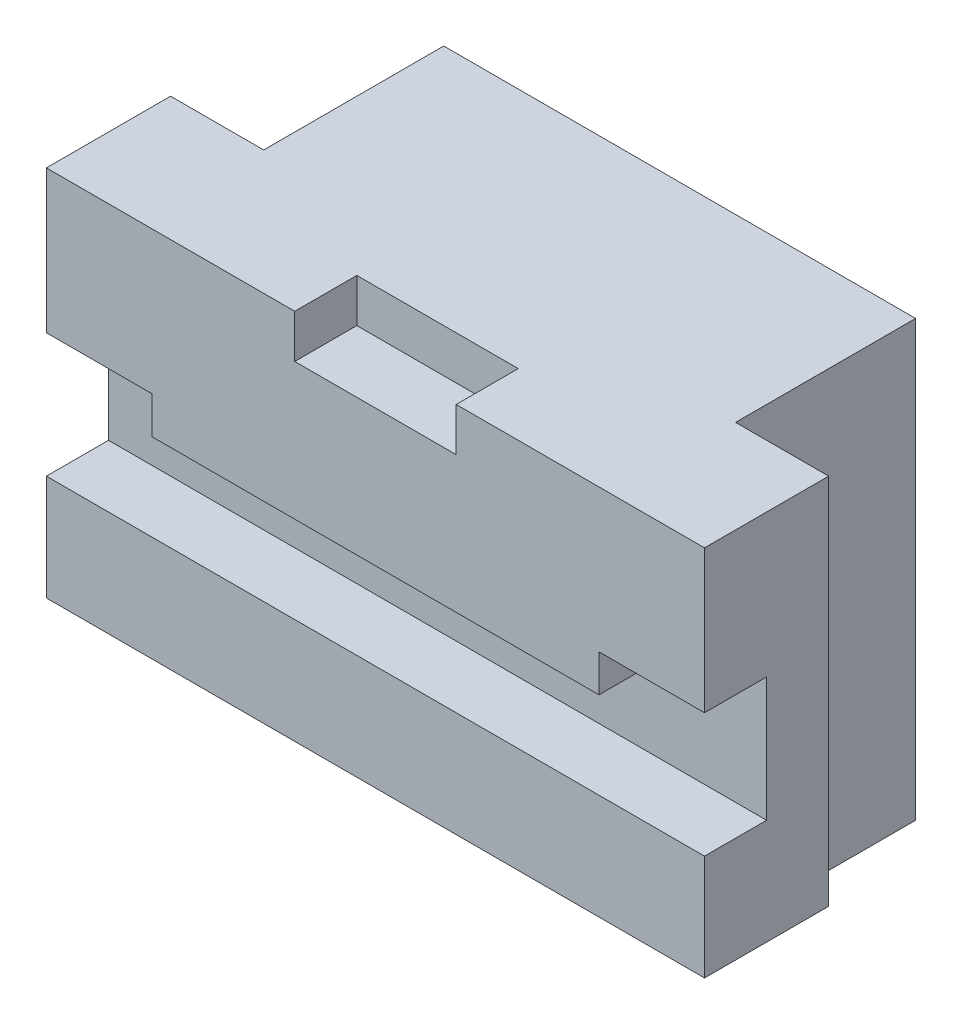
ISO-10303-21;
HEADER;
FILE_DESCRIPTION(('STEP AP214'),'2;1');
FILE_NAME('part.step','',(''),(''),'','','');
FILE_SCHEMA(('AUTOMOTIVE_DESIGN { 1 0 10303 214 1 1 1 1 }'));
ENDSEC;
DATA;
#1=APPLICATION_CONTEXT('core data for automotive mechanical design processes');
#2=APPLICATION_PROTOCOL_DEFINITION('international standard','automotive_design',2000,#1);
#3=PRODUCT_CONTEXT('',#1,'mechanical');
#4=PRODUCT('Part','Part','',(#3));
#5=PRODUCT_RELATED_PRODUCT_CATEGORY('part','',(#4));
#6=PRODUCT_DEFINITION_FORMATION('','',#4);
#7=PRODUCT_DEFINITION_CONTEXT('part definition',#1,'design');
#8=PRODUCT_DEFINITION('design','',#6,#7);
#9=PRODUCT_DEFINITION_SHAPE('','',#8);
#10=(LENGTH_UNIT() NAMED_UNIT(*) SI_UNIT(.MILLI.,.METRE.));
#11=(NAMED_UNIT(*) PLANE_ANGLE_UNIT() SI_UNIT($,.RADIAN.));
#12=(NAMED_UNIT(*) SI_UNIT($,.STERADIAN.) SOLID_ANGLE_UNIT());
#13=UNCERTAINTY_MEASURE_WITH_UNIT(LENGTH_MEASURE(1.E-05),#10,'distance_accuracy_value','');
#14=(GEOMETRIC_REPRESENTATION_CONTEXT(3) GLOBAL_UNCERTAINTY_ASSIGNED_CONTEXT((#13)) GLOBAL_UNIT_ASSIGNED_CONTEXT((#10,
#11,#12)) REPRESENTATION_CONTEXT('',''));
#15=CARTESIAN_POINT('',(0.,0.,0.));
#16=DIRECTION('',(0.,0.,1.));
#17=DIRECTION('',(1.,0.,0.));
#18=AXIS2_PLACEMENT_3D('',#15,#16,#17);
#19=CARTESIAN_POINT('',(0.,0.,-10.));
#20=DIRECTION('',(0.,0.,1.));
#21=DIRECTION('',(1.,0.,0.));
#22=AXIS2_PLACEMENT_3D('',#19,#20,#21);
#23=PLANE('',#22);
#24=DIRECTION('',(0.,-1.,0.));
#25=VECTOR('',#24,1.);
#26=CARTESIAN_POINT('',(11.5,30.,-10.));
#27=LINE('',#26,#25);
#28=CARTESIAN_POINT('',(11.5,30.,-10.));
#29=VERTEX_POINT('',#28);
#30=CARTESIAN_POINT('',(11.5,-30.,-10.));
#31=VERTEX_POINT('',#30);
#32=EDGE_CURVE('E59',#29,#31,#27,.T.);
#33=ORIENTED_EDGE('',*,*,#32,.F.);
#34=DIRECTION('',(1.,0.,0.));
#35=VECTOR('',#34,1.);
#36=CARTESIAN_POINT('',(26.5,30.,-10.));
#37=LINE('',#36,#35);
#38=CARTESIAN_POINT('',(26.5,30.,-10.));
#39=VERTEX_POINT('',#38);
#40=EDGE_CURVE('E262',#29,#39,#37,.T.);
#41=ORIENTED_EDGE('',*,*,#40,.T.);
#42=DIRECTION('',(0.,-1.,0.));
#43=VECTOR('',#42,1.);
#44=CARTESIAN_POINT('',(26.5,-30.,-10.));
#45=LINE('',#44,#43);
#46=CARTESIAN_POINT('',(26.5,-30.,-10.));
#47=VERTEX_POINT('',#46);
#48=EDGE_CURVE('E325',#39,#47,#45,.T.);
#49=ORIENTED_EDGE('',*,*,#48,.T.);
#50=DIRECTION('',(-1.,0.,0.));
#51=VECTOR('',#50,1.);
#52=CARTESIAN_POINT('',(-26.5,-30.,-10.));
#53=LINE('',#52,#51);
#54=EDGE_CURVE('E321',#47,#31,#53,.T.);
#55=ORIENTED_EDGE('',*,*,#54,.T.);
#56=EDGE_LOOP('',(#33,#41,#49,#55));
#57=FACE_BOUND('',#56,.T.);
#58=ADVANCED_FACE('F34',(#57),#23,.F.);
#59=CARTESIAN_POINT('',(0.,0.,0.));
#60=DIRECTION('',(0.,0.,1.));
#61=DIRECTION('',(1.,0.,0.));
#62=AXIS2_PLACEMENT_3D('',#59,#60,#61);
#63=PLANE('',#62);
#64=DIRECTION('',(-1.,0.,0.));
#65=VECTOR('',#64,1.);
#66=CARTESIAN_POINT('',(0.,1.,0.));
#67=LINE('',#66,#65);
#68=CARTESIAN_POINT('',(9.5,1.,0.));
#69=VERTEX_POINT('',#68);
#70=CARTESIAN_POINT('',(-62.5,0.999999999999993,0.));
#71=VERTEX_POINT('',#70);
#72=EDGE_CURVE('E300',#69,#71,#67,.T.);
#73=ORIENTED_EDGE('',*,*,#72,.T.);
#74=DIRECTION('',(0.,-1.,0.));
#75=VECTOR('',#74,1.);
#76=CARTESIAN_POINT('',(-62.5,0.,0.));
#77=LINE('',#76,#75);
#78=CARTESIAN_POINT('',(-62.5,6.99999999999999,0.));
#79=VERTEX_POINT('',#78);
#80=EDGE_CURVE('E399',#79,#71,#77,.T.);
#81=ORIENTED_EDGE('',*,*,#80,.F.);
#82=DIRECTION('',(1.,0.,0.));
#83=VECTOR('',#82,1.);
#84=CARTESIAN_POINT('',(-53.,6.99999999999999,0.));
#85=LINE('',#84,#83);
#86=CARTESIAN_POINT('',(-79.5,6.99999999999999,0.));
#87=VERTEX_POINT('',#86);
#88=EDGE_CURVE('E389',#87,#79,#85,.T.);
#89=ORIENTED_EDGE('',*,*,#88,.F.);
#90=DIRECTION('',(0.,-1.,0.));
#91=VECTOR('',#90,1.);
#92=CARTESIAN_POINT('',(-79.5,-30.,0.));
#93=LINE('',#92,#91);
#94=CARTESIAN_POINT('',(-79.5,-13.,0.));
#95=VERTEX_POINT('',#94);
#96=EDGE_CURVE('E365',#87,#95,#93,.T.);
#97=ORIENTED_EDGE('',*,*,#96,.T.);
#98=DIRECTION('',(-1.,0.,0.));
#99=VECTOR('',#98,1.);
#100=CARTESIAN_POINT('',(0.,-13.,0.));
#101=LINE('',#100,#99);
#102=CARTESIAN_POINT('',(26.5,-13.,0.));
#103=VERTEX_POINT('',#102);
#104=EDGE_CURVE('E266',#103,#95,#101,.T.);
#105=ORIENTED_EDGE('',*,*,#104,.F.);
#106=DIRECTION('',(0.,-1.,0.));
#107=VECTOR('',#106,1.);
#108=CARTESIAN_POINT('',(26.5,-30.,0.));
#109=LINE('',#108,#107);
#110=CARTESIAN_POINT('',(26.5,7.,0.));
#111=VERTEX_POINT('',#110);
#112=EDGE_CURVE('E317',#111,#103,#109,.T.);
#113=ORIENTED_EDGE('',*,*,#112,.F.);
#114=DIRECTION('',(-1.,0.,0.));
#115=VECTOR('',#114,1.);
#116=CARTESIAN_POINT('',(0.,7.,0.));
#117=LINE('',#116,#115);
#118=CARTESIAN_POINT('',(9.5,7.,0.));
#119=VERTEX_POINT('',#118);
#120=EDGE_CURVE('E295',#111,#119,#117,.T.);
#121=ORIENTED_EDGE('',*,*,#120,.T.);
#122=DIRECTION('',(0.,-1.,0.));
#123=VECTOR('',#122,1.);
#124=CARTESIAN_POINT('',(9.5,0.,0.));
#125=LINE('',#124,#123);
#126=EDGE_CURVE('E288',#119,#69,#125,.T.);
#127=ORIENTED_EDGE('',*,*,#126,.T.);
#128=EDGE_LOOP('',(#73,#81,#89,#97,#105,#113,#121,#127));
#129=FACE_BOUND('',#128,.T.);
#130=ADVANCED_FACE('F423',(#129),#63,.T.);
#131=CARTESIAN_POINT('',(0.,1.,10.));
#132=DIRECTION('',(0.,-1.,0.));
#133=DIRECTION('',(1.,0.,0.));
#134=AXIS2_PLACEMENT_3D('',#131,#132,#133);
#135=PLANE('',#134);
#136=ORIENTED_EDGE('',*,*,#72,.F.);
#137=DIRECTION('',(0.,0.,-1.));
#138=VECTOR('',#137,1.);
#139=CARTESIAN_POINT('',(9.5,1.,10.));
#140=LINE('',#139,#138);
#141=CARTESIAN_POINT('',(9.5,1.,10.));
#142=VERTEX_POINT('',#141);
#143=EDGE_CURVE('E11',#142,#69,#140,.T.);
#144=ORIENTED_EDGE('',*,*,#143,.F.);
#145=DIRECTION('',(-1.,0.,0.));
#146=VECTOR('',#145,1.);
#147=CARTESIAN_POINT('',(0.,1.,10.));
#148=LINE('',#147,#146);
#149=CARTESIAN_POINT('',(-62.5,0.999999999999993,10.));
#150=VERTEX_POINT('',#149);
#151=EDGE_CURVE('E298',#142,#150,#148,.T.);
#152=ORIENTED_EDGE('',*,*,#151,.T.);
#153=DIRECTION('',(0.,0.,-1.));
#154=VECTOR('',#153,1.);
#155=CARTESIAN_POINT('',(-62.5,0.999999999999993,10.));
#156=LINE('',#155,#154);
#157=EDGE_CURVE('E256',#150,#71,#156,.T.);
#158=ORIENTED_EDGE('',*,*,#157,.T.);
#159=EDGE_LOOP('',(#136,#144,#152,#158));
#160=FACE_BOUND('',#159,.T.);
#161=ADVANCED_FACE('F36',(#160),#135,.T.);
#162=CARTESIAN_POINT('',(9.5,0.,10.));
#163=DIRECTION('',(1.,0.,0.));
#164=DIRECTION('',(0.,0.,-1.));
#165=AXIS2_PLACEMENT_3D('',#162,#163,#164);
#166=PLANE('',#165);
#167=ORIENTED_EDGE('',*,*,#126,.F.);
#168=DIRECTION('',(0.,0.,-1.));
#169=VECTOR('',#168,1.);
#170=CARTESIAN_POINT('',(9.5,7.,10.));
#171=LINE('',#170,#169);
#172=CARTESIAN_POINT('',(9.5,7.,10.));
#173=VERTEX_POINT('',#172);
#174=EDGE_CURVE('E43',#173,#119,#171,.T.);
#175=ORIENTED_EDGE('',*,*,#174,.F.);
#176=DIRECTION('',(0.,-1.,0.));
#177=VECTOR('',#176,1.);
#178=CARTESIAN_POINT('',(9.5,0.,10.));
#179=LINE('',#178,#177);
#180=EDGE_CURVE('E313',#173,#142,#179,.T.);
#181=ORIENTED_EDGE('',*,*,#180,.T.);
#182=ORIENTED_EDGE('',*,*,#143,.T.);
#183=EDGE_LOOP('',(#167,#175,#181,#182));
#184=FACE_BOUND('',#183,.T.);
#185=ADVANCED_FACE('F441',(#184),#166,.T.);
#186=CARTESIAN_POINT('',(0.,7.,10.));
#187=DIRECTION('',(0.,-1.,0.));
#188=DIRECTION('',(1.,0.,0.));
#189=AXIS2_PLACEMENT_3D('',#186,#187,#188);
#190=PLANE('',#189);
#191=ORIENTED_EDGE('',*,*,#120,.F.);
#192=DIRECTION('',(0.,0.,-1.));
#193=VECTOR('',#192,1.);
#194=CARTESIAN_POINT('',(26.5,7.,10.));
#195=LINE('',#194,#193);
#196=CARTESIAN_POINT('',(26.5,7.,10.));
#197=VERTEX_POINT('',#196);
#198=EDGE_CURVE('E276',#197,#111,#195,.T.);
#199=ORIENTED_EDGE('',*,*,#198,.F.);
#200=DIRECTION('',(-1.,0.,0.));
#201=VECTOR('',#200,1.);
#202=CARTESIAN_POINT('',(0.,7.,10.));
#203=LINE('',#202,#201);
#204=EDGE_CURVE('E310',#197,#173,#203,.T.);
#205=ORIENTED_EDGE('',*,*,#204,.T.);
#206=ORIENTED_EDGE('',*,*,#174,.T.);
#207=EDGE_LOOP('',(#191,#199,#205,#206));
#208=FACE_BOUND('',#207,.T.);
#209=ADVANCED_FACE('F437',(#208),#190,.T.);
#210=CARTESIAN_POINT('',(26.5,0.,10.));
#211=DIRECTION('',(-1.,0.,0.));
#212=DIRECTION('',(0.,0.,1.));
#213=AXIS2_PLACEMENT_3D('',#210,#211,#212);
#214=PLANE('',#213);
#215=ORIENTED_EDGE('',*,*,#198,.T.);
#216=ORIENTED_EDGE('',*,*,#112,.T.);
#217=DIRECTION('',(0.,0.,-1.));
#218=VECTOR('',#217,1.);
#219=CARTESIAN_POINT('',(26.5,-13.,10.));
#220=LINE('',#219,#218);
#221=CARTESIAN_POINT('',(26.5,-13.,10.));
#222=VERTEX_POINT('',#221);
#223=EDGE_CURVE('E322',#222,#103,#220,.T.);
#224=ORIENTED_EDGE('',*,*,#223,.F.);
#225=DIRECTION('',(0.,1.,0.));
#226=VECTOR('',#225,1.);
#227=CARTESIAN_POINT('',(26.5,0.,10.));
#228=LINE('',#227,#226);
#229=CARTESIAN_POINT('',(26.5,-30.,10.));
#230=VERTEX_POINT('',#229);
#231=EDGE_CURVE('E330',#230,#222,#228,.T.);
#232=ORIENTED_EDGE('',*,*,#231,.F.);
#233=DIRECTION('',(0.,0.,1.));
#234=VECTOR('',#233,1.);
#235=CARTESIAN_POINT('',(26.5,-30.,-10.));
#236=LINE('',#235,#234);
#237=EDGE_CURVE('E301',#47,#230,#236,.T.);
#238=ORIENTED_EDGE('',*,*,#237,.F.);
#239=ORIENTED_EDGE('',*,*,#48,.F.);
#240=DIRECTION('',(0.,0.,-1.));
#241=VECTOR('',#240,1.);
#242=CARTESIAN_POINT('',(26.5,30.,10.));
#243=LINE('',#242,#241);
#244=CARTESIAN_POINT('',(26.5,30.,10.));
#245=VERTEX_POINT('',#244);
#246=EDGE_CURVE('E270',#245,#39,#243,.T.);
#247=ORIENTED_EDGE('',*,*,#246,.F.);
#248=DIRECTION('',(0.,1.,0.));
#249=VECTOR('',#248,1.);
#250=CARTESIAN_POINT('',(26.5,0.,10.));
#251=LINE('',#250,#249);
#252=EDGE_CURVE('E308',#197,#245,#251,.T.);
#253=ORIENTED_EDGE('',*,*,#252,.F.);
#254=EDGE_LOOP('',(#215,#216,#224,#232,#238,#239,#247,#253));
#255=FACE_BOUND('',#254,.T.);
#256=ADVANCED_FACE('F354',(#255),#214,.F.);
#257=CARTESIAN_POINT('',(0.,30.,10.));
#258=DIRECTION('',(0.,1.,0.));
#259=DIRECTION('',(0.,0.,1.));
#260=AXIS2_PLACEMENT_3D('',#257,#258,#259);
#261=PLANE('',#260);
#262=DIRECTION('',(-1.,0.,0.));
#263=VECTOR('',#262,1.);
#264=CARTESIAN_POINT('',(-13.5,30.,0.));
#265=LINE('',#264,#263);
#266=CARTESIAN_POINT('',(-13.5,30.,0.));
#267=VERTEX_POINT('',#266);
#268=CARTESIAN_POINT('',(-39.5,30.,0.));
#269=VERTEX_POINT('',#268);
#270=EDGE_CURVE('E51',#267,#269,#265,.T.);
#271=ORIENTED_EDGE('',*,*,#270,.F.);
#272=DIRECTION('',(0.,0.,-1.));
#273=VECTOR('',#272,1.);
#274=CARTESIAN_POINT('',(-13.5,30.,10.));
#275=LINE('',#274,#273);
#276=CARTESIAN_POINT('',(-13.5,30.,10.));
#277=VERTEX_POINT('',#276);
#278=EDGE_CURVE('E268',#277,#267,#275,.T.);
#279=ORIENTED_EDGE('',*,*,#278,.F.);
#280=DIRECTION('',(1.,0.,0.));
#281=VECTOR('',#280,1.);
#282=CARTESIAN_POINT('',(0.,30.,10.));
#283=LINE('',#282,#281);
#284=EDGE_CURVE('E305',#277,#245,#283,.T.);
#285=ORIENTED_EDGE('',*,*,#284,.T.);
#286=ORIENTED_EDGE('',*,*,#246,.T.);
#287=ORIENTED_EDGE('',*,*,#40,.F.);
#288=DIRECTION('',(0.,0.,1.));
#289=VECTOR('',#288,1.);
#290=CARTESIAN_POINT('',(11.5,30.,-19.));
#291=LINE('',#290,#289);
#292=CARTESIAN_POINT('',(11.5,30.,-39.));
#293=VERTEX_POINT('',#292);
#294=EDGE_CURVE('E196',#293,#29,#291,.T.);
#295=ORIENTED_EDGE('',*,*,#294,.F.);
#296=DIRECTION('',(1.,0.,0.));
#297=VECTOR('',#296,1.);
#298=CARTESIAN_POINT('',(-64.5,30.,-39.));
#299=LINE('',#298,#297);
#300=CARTESIAN_POINT('',(-64.5,30.,-39.));
#301=VERTEX_POINT('',#300);
#302=EDGE_CURVE('E212',#301,#293,#299,.T.);
#303=ORIENTED_EDGE('',*,*,#302,.F.);
#304=DIRECTION('',(0.,0.,1.));
#305=VECTOR('',#304,1.);
#306=CARTESIAN_POINT('',(-64.5,30.,-19.));
#307=LINE('',#306,#305);
#308=CARTESIAN_POINT('',(-64.5,30.,-10.));
#309=VERTEX_POINT('',#308);
#310=EDGE_CURVE('E241',#301,#309,#307,.T.);
#311=ORIENTED_EDGE('',*,*,#310,.T.);
#312=DIRECTION('',(-1.,0.,0.));
#313=VECTOR('',#312,1.);
#314=CARTESIAN_POINT('',(-79.5,30.,-10.));
#315=LINE('',#314,#313);
#316=CARTESIAN_POINT('',(-79.5,30.,-10.));
#317=VERTEX_POINT('',#316);
#318=EDGE_CURVE('E238',#309,#317,#315,.T.);
#319=ORIENTED_EDGE('',*,*,#318,.T.);
#320=DIRECTION('',(0.,0.,-1.));
#321=VECTOR('',#320,1.);
#322=CARTESIAN_POINT('',(-79.5,30.,10.));
#323=LINE('',#322,#321);
#324=CARTESIAN_POINT('',(-79.5,30.,10.));
#325=VERTEX_POINT('',#324);
#326=EDGE_CURVE('E249',#325,#317,#323,.T.);
#327=ORIENTED_EDGE('',*,*,#326,.F.);
#328=DIRECTION('',(-1.,0.,0.));
#329=VECTOR('',#328,1.);
#330=CARTESIAN_POINT('',(-53.,30.,10.));
#331=LINE('',#330,#329);
#332=CARTESIAN_POINT('',(-39.5,30.,10.));
#333=VERTEX_POINT('',#332);
#334=EDGE_CURVE('E394',#333,#325,#331,.T.);
#335=ORIENTED_EDGE('',*,*,#334,.F.);
#336=DIRECTION('',(0.,0.,-1.));
#337=VECTOR('',#336,1.);
#338=CARTESIAN_POINT('',(-39.5,30.,10.));
#339=LINE('',#338,#337);
#340=EDGE_CURVE('E246',#333,#269,#339,.T.);
#341=ORIENTED_EDGE('',*,*,#340,.T.);
#342=EDGE_LOOP('',(#271,#279,#285,#286,#287,#295,#303,#311,#319,#327,#335,#341));
#343=FACE_BOUND('',#342,.T.);
#344=ADVANCED_FACE('F466',(#343),#261,.T.);
#345=CARTESIAN_POINT('',(-13.5,0.,10.));
#346=DIRECTION('',(1.,0.,0.));
#347=DIRECTION('',(0.,1.,0.));
#348=AXIS2_PLACEMENT_3D('',#345,#346,#347);
#349=PLANE('',#348);
#350=ORIENTED_EDGE('',*,*,#278,.T.);
#351=DIRECTION('',(0.,1.,0.));
#352=VECTOR('',#351,1.);
#353=CARTESIAN_POINT('',(-13.5,23.,0.));
#354=LINE('',#353,#352);
#355=CARTESIAN_POINT('',(-13.5,23.,0.));
#356=VERTEX_POINT('',#355);
#357=EDGE_CURVE('E217',#356,#267,#354,.T.);
#358=ORIENTED_EDGE('',*,*,#357,.F.);
#359=DIRECTION('',(0.,0.,-1.));
#360=VECTOR('',#359,1.);
#361=CARTESIAN_POINT('',(-13.5,23.,10.));
#362=LINE('',#361,#360);
#363=CARTESIAN_POINT('',(-13.5,23.,10.));
#364=VERTEX_POINT('',#363);
#365=EDGE_CURVE('E271',#364,#356,#362,.T.);
#366=ORIENTED_EDGE('',*,*,#365,.F.);
#367=DIRECTION('',(0.,-1.,0.));
#368=VECTOR('',#367,1.);
#369=CARTESIAN_POINT('',(-13.5,0.,10.));
#370=LINE('',#369,#368);
#371=EDGE_CURVE('E285',#277,#364,#370,.T.);
#372=ORIENTED_EDGE('',*,*,#371,.F.);
#373=EDGE_LOOP('',(#350,#358,#366,#372));
#374=FACE_BOUND('',#373,.T.);
#375=ADVANCED_FACE('F463',(#374),#349,.F.);
#376=CARTESIAN_POINT('',(0.,23.,10.));
#377=DIRECTION('',(0.,1.,0.));
#378=DIRECTION('',(0.,0.,1.));
#379=AXIS2_PLACEMENT_3D('',#376,#377,#378);
#380=PLANE('',#379);
#381=DIRECTION('',(1.,0.,0.));
#382=VECTOR('',#381,1.);
#383=CARTESIAN_POINT('',(-39.5,23.,0.));
#384=LINE('',#383,#382);
#385=CARTESIAN_POINT('',(-39.5,23.,0.));
#386=VERTEX_POINT('',#385);
#387=EDGE_CURVE('E222',#386,#356,#384,.T.);
#388=ORIENTED_EDGE('',*,*,#387,.F.);
#389=DIRECTION('',(0.,0.,-1.));
#390=VECTOR('',#389,1.);
#391=CARTESIAN_POINT('',(-39.5,23.,10.));
#392=LINE('',#391,#390);
#393=CARTESIAN_POINT('',(-39.5,23.,10.));
#394=VERTEX_POINT('',#393);
#395=EDGE_CURVE('E250',#394,#386,#392,.T.);
#396=ORIENTED_EDGE('',*,*,#395,.F.);
#397=DIRECTION('',(1.,0.,0.));
#398=VECTOR('',#397,1.);
#399=CARTESIAN_POINT('',(0.,23.,10.));
#400=LINE('',#399,#398);
#401=EDGE_CURVE('E279',#394,#364,#400,.T.);
#402=ORIENTED_EDGE('',*,*,#401,.T.);
#403=ORIENTED_EDGE('',*,*,#365,.T.);
#404=EDGE_LOOP('',(#388,#396,#402,#403));
#405=FACE_BOUND('',#404,.T.);
#406=ADVANCED_FACE('F460',(#405),#380,.T.);
#407=CARTESIAN_POINT('',(0.,0.,10.));
#408=DIRECTION('',(0.,0.,1.));
#409=DIRECTION('',(1.,0.,0.));
#410=AXIS2_PLACEMENT_3D('',#407,#408,#409);
#411=PLANE('',#410);
#412=ORIENTED_EDGE('',*,*,#151,.F.);
#413=ORIENTED_EDGE('',*,*,#180,.F.);
#414=ORIENTED_EDGE('',*,*,#204,.F.);
#415=ORIENTED_EDGE('',*,*,#252,.T.);
#416=ORIENTED_EDGE('',*,*,#284,.F.);
#417=ORIENTED_EDGE('',*,*,#371,.T.);
#418=ORIENTED_EDGE('',*,*,#401,.F.);
#419=DIRECTION('',(0.,-1.,0.));
#420=VECTOR('',#419,1.);
#421=CARTESIAN_POINT('',(-39.5,0.,10.));
#422=LINE('',#421,#420);
#423=EDGE_CURVE('E396',#333,#394,#422,.T.);
#424=ORIENTED_EDGE('',*,*,#423,.F.);
#425=ORIENTED_EDGE('',*,*,#334,.T.);
#426=DIRECTION('',(0.,1.,0.));
#427=VECTOR('',#426,1.);
#428=CARTESIAN_POINT('',(-79.5,0.,10.));
#429=LINE('',#428,#427);
#430=CARTESIAN_POINT('',(-79.5,6.99999999999999,10.));
#431=VERTEX_POINT('',#430);
#432=EDGE_CURVE('E391',#431,#325,#429,.T.);
#433=ORIENTED_EDGE('',*,*,#432,.F.);
#434=DIRECTION('',(1.,0.,0.));
#435=VECTOR('',#434,1.);
#436=CARTESIAN_POINT('',(-53.,6.99999999999999,10.));
#437=LINE('',#436,#435);
#438=CARTESIAN_POINT('',(-62.5,6.99999999999999,10.));
#439=VERTEX_POINT('',#438);
#440=EDGE_CURVE('E388',#431,#439,#437,.T.);
#441=ORIENTED_EDGE('',*,*,#440,.T.);
#442=DIRECTION('',(0.,-1.,0.));
#443=VECTOR('',#442,1.);
#444=CARTESIAN_POINT('',(-62.5,0.,10.));
#445=LINE('',#444,#443);
#446=EDGE_CURVE('E385',#439,#150,#445,.T.);
#447=ORIENTED_EDGE('',*,*,#446,.T.);
#448=EDGE_LOOP('',(#412,#413,#414,#415,#416,#417,#418,#424,#425,#433,#441,#447));
#449=FACE_BOUND('',#448,.T.);
#450=ADVANCED_FACE('F430',(#449),#411,.T.);
#451=CARTESIAN_POINT('',(-26.5,-30.,-10.));
#452=DIRECTION('',(0.,1.,0.));
#453=DIRECTION('',(0.,0.,1.));
#454=AXIS2_PLACEMENT_3D('',#451,#452,#453);
#455=PLANE('',#454);
#456=DIRECTION('',(1.,0.,0.));
#457=VECTOR('',#456,1.);
#458=CARTESIAN_POINT('',(0.,-30.,10.));
#459=LINE('',#458,#457);
#460=CARTESIAN_POINT('',(11.5,-30.,10.));
#461=VERTEX_POINT('',#460);
#462=EDGE_CURVE('E337',#461,#230,#459,.T.);
#463=ORIENTED_EDGE('',*,*,#462,.F.);
#464=DIRECTION('',(0.,0.,1.));
#465=VECTOR('',#464,1.);
#466=CARTESIAN_POINT('',(11.5,-30.,10.));
#467=LINE('',#466,#465);
#468=EDGE_CURVE('E254',#31,#461,#467,.T.);
#469=ORIENTED_EDGE('',*,*,#468,.F.);
#470=ORIENTED_EDGE('',*,*,#54,.F.);
#471=ORIENTED_EDGE('',*,*,#237,.T.);
#472=EDGE_LOOP('',(#463,#469,#470,#471));
#473=FACE_BOUND('',#472,.T.);
#474=ADVANCED_FACE('F351',(#473),#455,.F.);
#475=CARTESIAN_POINT('',(0.,-13.,10.));
#476=DIRECTION('',(0.,-1.,0.));
#477=DIRECTION('',(1.,0.,0.));
#478=AXIS2_PLACEMENT_3D('',#475,#476,#477);
#479=PLANE('',#478);
#480=ORIENTED_EDGE('',*,*,#104,.T.);
#481=DIRECTION('',(0.,0.,-1.));
#482=VECTOR('',#481,1.);
#483=CARTESIAN_POINT('',(-79.5,-13.,10.));
#484=LINE('',#483,#482);
#485=CARTESIAN_POINT('',(-79.5,-13.,10.));
#486=VERTEX_POINT('',#485);
#487=EDGE_CURVE('E360',#486,#95,#484,.T.);
#488=ORIENTED_EDGE('',*,*,#487,.F.);
#489=DIRECTION('',(-1.,0.,0.));
#490=VECTOR('',#489,1.);
#491=CARTESIAN_POINT('',(0.,-13.,10.));
#492=LINE('',#491,#490);
#493=EDGE_CURVE('E332',#222,#486,#492,.T.);
#494=ORIENTED_EDGE('',*,*,#493,.F.);
#495=ORIENTED_EDGE('',*,*,#223,.T.);
#496=EDGE_LOOP('',(#480,#488,#494,#495));
#497=FACE_BOUND('',#496,.T.);
#498=ADVANCED_FACE('F358',(#497),#479,.F.);
#499=CARTESIAN_POINT('',(0.,0.,10.));
#500=DIRECTION('',(0.,0.,1.));
#501=DIRECTION('',(1.,0.,0.));
#502=AXIS2_PLACEMENT_3D('',#499,#500,#501);
#503=PLANE('',#502);
#504=ORIENTED_EDGE('',*,*,#493,.T.);
#505=DIRECTION('',(0.,1.,0.));
#506=VECTOR('',#505,1.);
#507=CARTESIAN_POINT('',(-79.5,0.,10.));
#508=LINE('',#507,#506);
#509=CARTESIAN_POINT('',(-79.5,-30.,10.));
#510=VERTEX_POINT('',#509);
#511=EDGE_CURVE('E366',#510,#486,#508,.T.);
#512=ORIENTED_EDGE('',*,*,#511,.F.);
#513=DIRECTION('',(-1.,0.,0.));
#514=VECTOR('',#513,1.);
#515=CARTESIAN_POINT('',(-53.,-30.,10.));
#516=LINE('',#515,#514);
#517=CARTESIAN_POINT('',(-64.5,-30.,10.));
#518=VERTEX_POINT('',#517);
#519=EDGE_CURVE('E243',#518,#510,#516,.T.);
#520=ORIENTED_EDGE('',*,*,#519,.F.);
#521=EDGE_CURVE('E334',#518,#461,#459,.T.);
#522=ORIENTED_EDGE('',*,*,#521,.T.);
#523=ORIENTED_EDGE('',*,*,#462,.T.);
#524=ORIENTED_EDGE('',*,*,#231,.T.);
#525=EDGE_LOOP('',(#504,#512,#520,#522,#523,#524));
#526=FACE_BOUND('',#525,.T.);
#527=ADVANCED_FACE('F344',(#526),#503,.T.);
#528=CARTESIAN_POINT('',(11.5,30.,-19.));
#529=DIRECTION('',(-1.,0.,0.));
#530=DIRECTION('',(0.,-1.,0.));
#531=AXIS2_PLACEMENT_3D('',#528,#529,#530);
#532=PLANE('',#531);
#533=ORIENTED_EDGE('',*,*,#32,.T.);
#534=ORIENTED_EDGE('',*,*,#468,.T.);
#535=DIRECTION('',(0.,-0.447213595499958,-0.894427190999916));
#536=VECTOR('',#535,1.);
#537=CARTESIAN_POINT('',(11.5,-40.,-10.));
#538=LINE('',#537,#536);
#539=CARTESIAN_POINT('',(11.5,-40.,-10.));
#540=VERTEX_POINT('',#539);
#541=EDGE_CURVE('E194',#461,#540,#538,.T.);
#542=ORIENTED_EDGE('',*,*,#541,.T.);
#543=DIRECTION('',(0.,0.,1.));
#544=VECTOR('',#543,1.);
#545=CARTESIAN_POINT('',(11.5,-40.,-19.));
#546=LINE('',#545,#544);
#547=CARTESIAN_POINT('',(11.5,-40.,-39.));
#548=VERTEX_POINT('',#547);
#549=EDGE_CURVE('E187',#548,#540,#546,.T.);
#550=ORIENTED_EDGE('',*,*,#549,.F.);
#551=DIRECTION('',(0.,-1.,0.));
#552=VECTOR('',#551,1.);
#553=CARTESIAN_POINT('',(11.5,30.,-39.));
#554=LINE('',#553,#552);
#555=EDGE_CURVE('E192',#293,#548,#554,.T.);
#556=ORIENTED_EDGE('',*,*,#555,.F.);
#557=ORIENTED_EDGE('',*,*,#294,.T.);
#558=EDGE_LOOP('',(#533,#534,#542,#550,#556,#557));
#559=FACE_BOUND('',#558,.T.);
#560=ADVANCED_FACE('F189',(#559),#532,.F.);
#561=CARTESIAN_POINT('',(-26.5,-40.,-19.));
#562=DIRECTION('',(0.,1.,0.));
#563=DIRECTION('',(-1.,0.,0.));
#564=AXIS2_PLACEMENT_3D('',#561,#562,#563);
#565=PLANE('',#564);
#566=DIRECTION('',(-1.,0.,0.));
#567=VECTOR('',#566,1.);
#568=CARTESIAN_POINT('',(-26.5,-40.,-10.));
#569=LINE('',#568,#567);
#570=CARTESIAN_POINT('',(-64.5,-40.,-10.));
#571=VERTEX_POINT('',#570);
#572=EDGE_CURVE('E197',#540,#571,#569,.T.);
#573=ORIENTED_EDGE('',*,*,#572,.T.);
#574=DIRECTION('',(0.,0.,1.));
#575=VECTOR('',#574,1.);
#576=CARTESIAN_POINT('',(-64.5,-40.,-19.));
#577=LINE('',#576,#575);
#578=CARTESIAN_POINT('',(-64.5,-40.,-39.));
#579=VERTEX_POINT('',#578);
#580=EDGE_CURVE('E203',#579,#571,#577,.T.);
#581=ORIENTED_EDGE('',*,*,#580,.F.);
#582=DIRECTION('',(-1.,0.,0.));
#583=VECTOR('',#582,1.);
#584=CARTESIAN_POINT('',(11.5,-40.,-39.));
#585=LINE('',#584,#583);
#586=EDGE_CURVE('E200',#548,#579,#585,.T.);
#587=ORIENTED_EDGE('',*,*,#586,.F.);
#588=ORIENTED_EDGE('',*,*,#549,.T.);
#589=EDGE_LOOP('',(#573,#581,#587,#588));
#590=FACE_BOUND('',#589,.T.);
#591=ADVANCED_FACE('F201',(#590),#565,.F.);
#592=CARTESIAN_POINT('',(-48.8606797749979,-40.,-10.));
#593=DIRECTION('',(0.,-0.894427190999916,0.447213595499958));
#594=DIRECTION('',(0.,-0.447213595499958,-0.894427190999916));
#595=AXIS2_PLACEMENT_3D('',#592,#593,#594);
#596=PLANE('',#595);
#597=ORIENTED_EDGE('',*,*,#521,.F.);
#598=DIRECTION('',(0.,-0.447213595499958,-0.894427190999916));
#599=VECTOR('',#598,1.);
#600=CARTESIAN_POINT('',(-64.5,-40.,-10.));
#601=LINE('',#600,#599);
#602=EDGE_CURVE('E225',#518,#571,#601,.T.);
#603=ORIENTED_EDGE('',*,*,#602,.T.);
#604=ORIENTED_EDGE('',*,*,#572,.F.);
#605=ORIENTED_EDGE('',*,*,#541,.F.);
#606=EDGE_LOOP('',(#597,#603,#604,#605));
#607=FACE_BOUND('',#606,.T.);
#608=ADVANCED_FACE('F531',(#607),#596,.T.);
#609=CARTESIAN_POINT('',(-53.,0.,-10.));
#610=DIRECTION('',(0.,0.,1.));
#611=DIRECTION('',(-1.,0.,0.));
#612=AXIS2_PLACEMENT_3D('',#609,#610,#611);
#613=PLANE('',#612);
#614=DIRECTION('',(0.,-1.,0.));
#615=VECTOR('',#614,1.);
#616=CARTESIAN_POINT('',(-64.5,30.,-10.));
#617=LINE('',#616,#615);
#618=CARTESIAN_POINT('',(-64.5,-30.,-10.));
#619=VERTEX_POINT('',#618);
#620=EDGE_CURVE('E228',#309,#619,#617,.T.);
#621=ORIENTED_EDGE('',*,*,#620,.T.);
#622=DIRECTION('',(1.,0.,0.));
#623=VECTOR('',#622,1.);
#624=CARTESIAN_POINT('',(-26.5,-30.,-10.));
#625=LINE('',#624,#623);
#626=CARTESIAN_POINT('',(-79.5,-30.,-10.));
#627=VERTEX_POINT('',#626);
#628=EDGE_CURVE('E375',#627,#619,#625,.T.);
#629=ORIENTED_EDGE('',*,*,#628,.F.);
#630=DIRECTION('',(0.,-1.,0.));
#631=VECTOR('',#630,1.);
#632=CARTESIAN_POINT('',(-79.5,-30.,-10.));
#633=LINE('',#632,#631);
#634=EDGE_CURVE('E379',#317,#627,#633,.T.);
#635=ORIENTED_EDGE('',*,*,#634,.F.);
#636=ORIENTED_EDGE('',*,*,#318,.F.);
#637=EDGE_LOOP('',(#621,#629,#635,#636));
#638=FACE_BOUND('',#637,.T.);
#639=ADVANCED_FACE('F538',(#638),#613,.F.);
#640=CARTESIAN_POINT('',(-62.5,0.,10.));
#641=DIRECTION('',(-1.,0.,0.));
#642=DIRECTION('',(0.,0.,-1.));
#643=AXIS2_PLACEMENT_3D('',#640,#641,#642);
#644=PLANE('',#643);
#645=ORIENTED_EDGE('',*,*,#80,.T.);
#646=ORIENTED_EDGE('',*,*,#157,.F.);
#647=ORIENTED_EDGE('',*,*,#446,.F.);
#648=DIRECTION('',(0.,0.,-1.));
#649=VECTOR('',#648,1.);
#650=CARTESIAN_POINT('',(-62.5,6.99999999999999,10.));
#651=LINE('',#650,#649);
#652=EDGE_CURVE('E406',#439,#79,#651,.T.);
#653=ORIENTED_EDGE('',*,*,#652,.T.);
#654=EDGE_LOOP('',(#645,#646,#647,#653));
#655=FACE_BOUND('',#654,.T.);
#656=ADVANCED_FACE('F427',(#655),#644,.T.);
#657=CARTESIAN_POINT('',(-53.,6.99999999999999,10.));
#658=DIRECTION('',(0.,-1.,0.));
#659=DIRECTION('',(-1.,0.,0.));
#660=AXIS2_PLACEMENT_3D('',#657,#658,#659);
#661=PLANE('',#660);
#662=ORIENTED_EDGE('',*,*,#88,.T.);
#663=ORIENTED_EDGE('',*,*,#652,.F.);
#664=ORIENTED_EDGE('',*,*,#440,.F.);
#665=DIRECTION('',(0.,0.,-1.));
#666=VECTOR('',#665,1.);
#667=CARTESIAN_POINT('',(-79.5,6.99999999999999,10.));
#668=LINE('',#667,#666);
#669=EDGE_CURVE('E405',#431,#87,#668,.T.);
#670=ORIENTED_EDGE('',*,*,#669,.T.);
#671=EDGE_LOOP('',(#662,#663,#664,#670));
#672=FACE_BOUND('',#671,.T.);
#673=ADVANCED_FACE('F419',(#672),#661,.T.);
#674=CARTESIAN_POINT('',(-79.5,0.,10.));
#675=DIRECTION('',(1.,0.,0.));
#676=DIRECTION('',(0.,0.,1.));
#677=AXIS2_PLACEMENT_3D('',#674,#675,#676);
#678=PLANE('',#677);
#679=ORIENTED_EDGE('',*,*,#669,.F.);
#680=ORIENTED_EDGE('',*,*,#432,.T.);
#681=ORIENTED_EDGE('',*,*,#326,.T.);
#682=ORIENTED_EDGE('',*,*,#634,.T.);
#683=DIRECTION('',(0.,0.,1.));
#684=VECTOR('',#683,1.);
#685=CARTESIAN_POINT('',(-79.5,-30.,-10.));
#686=LINE('',#685,#684);
#687=EDGE_CURVE('E372',#627,#510,#686,.T.);
#688=ORIENTED_EDGE('',*,*,#687,.T.);
#689=ORIENTED_EDGE('',*,*,#511,.T.);
#690=ORIENTED_EDGE('',*,*,#487,.T.);
#691=ORIENTED_EDGE('',*,*,#96,.F.);
#692=EDGE_LOOP('',(#679,#680,#681,#682,#688,#689,#690,#691));
#693=FACE_BOUND('',#692,.T.);
#694=ADVANCED_FACE('F370',(#693),#678,.F.);
#695=CARTESIAN_POINT('',(-39.5,0.,10.));
#696=DIRECTION('',(-1.,0.,0.));
#697=DIRECTION('',(0.,1.,0.));
#698=AXIS2_PLACEMENT_3D('',#695,#696,#697);
#699=PLANE('',#698);
#700=ORIENTED_EDGE('',*,*,#395,.T.);
#701=DIRECTION('',(0.,-1.,0.));
#702=VECTOR('',#701,1.);
#703=CARTESIAN_POINT('',(-39.5,30.,0.));
#704=LINE('',#703,#702);
#705=EDGE_CURVE('E220',#269,#386,#704,.T.);
#706=ORIENTED_EDGE('',*,*,#705,.F.);
#707=ORIENTED_EDGE('',*,*,#340,.F.);
#708=ORIENTED_EDGE('',*,*,#423,.T.);
#709=EDGE_LOOP('',(#700,#706,#707,#708));
#710=FACE_BOUND('',#709,.T.);
#711=ADVANCED_FACE('F565',(#710),#699,.F.);
#712=CARTESIAN_POINT('',(-26.5,-30.,-10.));
#713=DIRECTION('',(0.,1.,0.));
#714=DIRECTION('',(0.,0.,1.));
#715=AXIS2_PLACEMENT_3D('',#712,#713,#714);
#716=PLANE('',#715);
#717=ORIENTED_EDGE('',*,*,#519,.T.);
#718=ORIENTED_EDGE('',*,*,#687,.F.);
#719=ORIENTED_EDGE('',*,*,#628,.T.);
#720=DIRECTION('',(0.,0.,1.));
#721=VECTOR('',#720,1.);
#722=CARTESIAN_POINT('',(-64.5,-30.,10.));
#723=LINE('',#722,#721);
#724=EDGE_CURVE('E224',#619,#518,#723,.T.);
#725=ORIENTED_EDGE('',*,*,#724,.T.);
#726=EDGE_LOOP('',(#717,#718,#719,#725));
#727=FACE_BOUND('',#726,.T.);
#728=ADVANCED_FACE('F571',(#727),#716,.F.);
#729=CARTESIAN_POINT('',(-64.5,30.,-19.));
#730=DIRECTION('',(1.,0.,0.));
#731=DIRECTION('',(0.,-1.,0.));
#732=AXIS2_PLACEMENT_3D('',#729,#730,#731);
#733=PLANE('',#732);
#734=ORIENTED_EDGE('',*,*,#620,.F.);
#735=ORIENTED_EDGE('',*,*,#310,.F.);
#736=DIRECTION('',(0.,1.,0.));
#737=VECTOR('',#736,1.);
#738=CARTESIAN_POINT('',(-64.5,-40.,-39.));
#739=LINE('',#738,#737);
#740=EDGE_CURVE('E207',#579,#301,#739,.T.);
#741=ORIENTED_EDGE('',*,*,#740,.F.);
#742=ORIENTED_EDGE('',*,*,#580,.T.);
#743=ORIENTED_EDGE('',*,*,#602,.F.);
#744=ORIENTED_EDGE('',*,*,#724,.F.);
#745=EDGE_LOOP('',(#734,#735,#741,#742,#743,#744));
#746=FACE_BOUND('',#745,.T.);
#747=ADVANCED_FACE('F578',(#746),#733,.F.);
#748=CARTESIAN_POINT('',(0.,0.,0.));
#749=DIRECTION('',(0.,0.,1.));
#750=DIRECTION('',(1.,0.,0.));
#751=AXIS2_PLACEMENT_3D('',#748,#749,#750);
#752=PLANE('',#751);
#753=ORIENTED_EDGE('',*,*,#357,.T.);
#754=ORIENTED_EDGE('',*,*,#270,.T.);
#755=ORIENTED_EDGE('',*,*,#705,.T.);
#756=ORIENTED_EDGE('',*,*,#387,.T.);
#757=EDGE_LOOP('',(#753,#754,#755,#756));
#758=FACE_BOUND('',#757,.T.);
#759=ADVANCED_FACE('F585',(#758),#752,.T.);
#760=CARTESIAN_POINT('',(0.,0.,-39.));
#761=DIRECTION('',(0.,0.,-1.));
#762=DIRECTION('',(-1.,0.,0.));
#763=AXIS2_PLACEMENT_3D('',#760,#761,#762);
#764=PLANE('',#763);
#765=ORIENTED_EDGE('',*,*,#555,.T.);
#766=ORIENTED_EDGE('',*,*,#586,.T.);
#767=ORIENTED_EDGE('',*,*,#740,.T.);
#768=ORIENTED_EDGE('',*,*,#302,.T.);
#769=EDGE_LOOP('',(#765,#766,#767,#768));
#770=FACE_BOUND('',#769,.T.);
#771=ADVANCED_FACE('F210',(#770),#764,.T.);
#772=CLOSED_SHELL('',(#58,#130,#161,#185,#209,#256,#344,#375,#406,#450,#474,#498,#527,#560,#591,
#608,#639,#656,#673,#694,#711,#728,#747,#759,#771));
#773=MANIFOLD_SOLID_BREP('B2',#772);
#774=ADVANCED_BREP_SHAPE_REPRESENTATION('',(#18,#773),#14);
#775=SHAPE_DEFINITION_REPRESENTATION(#9,#774);
ENDSEC;
END-ISO-10303-21;
